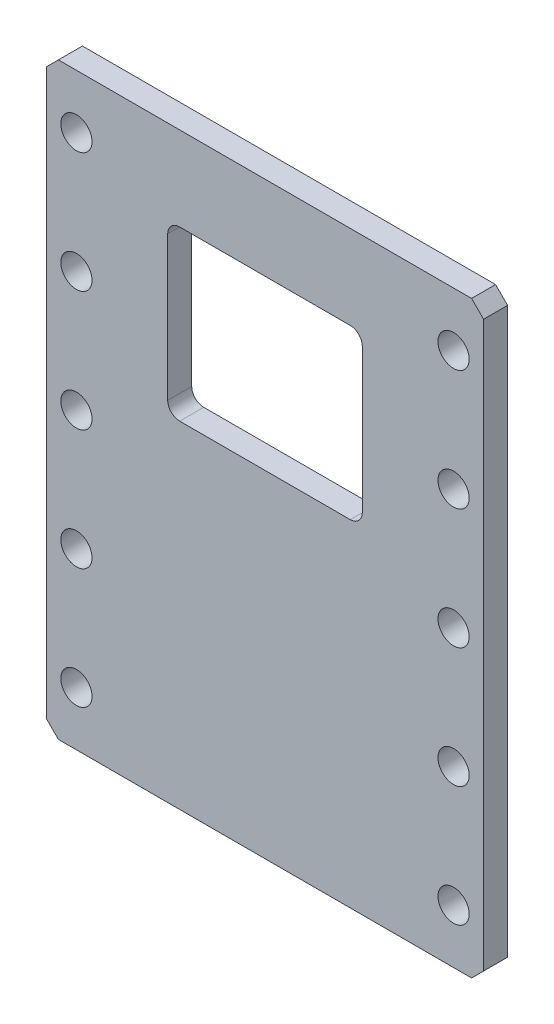
ISO-10303-21;
HEADER;
FILE_DESCRIPTION(('STEP AP214'),'2;1');
FILE_NAME('part.step','',(''),(''),'','','');
FILE_SCHEMA(('AUTOMOTIVE_DESIGN { 1 0 10303 214 1 1 1 1 }'));
ENDSEC;
DATA;
#1=APPLICATION_CONTEXT('core data for automotive mechanical design processes');
#2=APPLICATION_PROTOCOL_DEFINITION('international standard','automotive_design',2000,#1);
#3=PRODUCT_CONTEXT('',#1,'mechanical');
#4=PRODUCT('Part','Part','',(#3));
#5=PRODUCT_RELATED_PRODUCT_CATEGORY('part','',(#4));
#6=PRODUCT_DEFINITION_FORMATION('','',#4);
#7=PRODUCT_DEFINITION_CONTEXT('part definition',#1,'design');
#8=PRODUCT_DEFINITION('design','',#6,#7);
#9=PRODUCT_DEFINITION_SHAPE('','',#8);
#10=(LENGTH_UNIT() NAMED_UNIT(*) SI_UNIT(.MILLI.,.METRE.));
#11=(NAMED_UNIT(*) PLANE_ANGLE_UNIT() SI_UNIT($,.RADIAN.));
#12=(NAMED_UNIT(*) SI_UNIT($,.STERADIAN.) SOLID_ANGLE_UNIT());
#13=UNCERTAINTY_MEASURE_WITH_UNIT(LENGTH_MEASURE(1.E-05),#10,'distance_accuracy_value','');
#14=(GEOMETRIC_REPRESENTATION_CONTEXT(3) GLOBAL_UNCERTAINTY_ASSIGNED_CONTEXT((#13)) GLOBAL_UNIT_ASSIGNED_CONTEXT((#10,
#11,#12)) REPRESENTATION_CONTEXT('',''));
#15=CARTESIAN_POINT('',(0.,0.,0.));
#16=DIRECTION('',(0.,0.,1.));
#17=DIRECTION('',(1.,0.,0.));
#18=AXIS2_PLACEMENT_3D('',#15,#16,#17);
#19=CARTESIAN_POINT('',(182.,245.,20.));
#20=DIRECTION('',(-1.,0.,0.));
#21=DIRECTION('',(0.,-1.,0.));
#22=AXIS2_PLACEMENT_3D('',#19,#20,#21);
#23=PLANE('',#22);
#24=DIRECTION('',(0.,1.,0.));
#25=VECTOR('',#24,1.);
#26=CARTESIAN_POINT('',(182.,245.,20.));
#27=LINE('',#26,#25);
#28=CARTESIAN_POINT('',(182.,-235.,20.));
#29=VERTEX_POINT('',#28);
#30=CARTESIAN_POINT('',(182.,235.,20.));
#31=VERTEX_POINT('',#30);
#32=EDGE_CURVE('E272',#29,#31,#27,.T.);
#33=ORIENTED_EDGE('',*,*,#32,.F.);
#34=DIRECTION('',(0.,0.,-1.));
#35=VECTOR('',#34,1.);
#36=CARTESIAN_POINT('',(182.,-235.,20.));
#37=LINE('',#36,#35);
#38=CARTESIAN_POINT('',(182.,-235.,0.));
#39=VERTEX_POINT('',#38);
#40=EDGE_CURVE('E319',#29,#39,#37,.T.);
#41=ORIENTED_EDGE('',*,*,#40,.T.);
#42=DIRECTION('',(0.,1.,0.));
#43=VECTOR('',#42,1.);
#44=CARTESIAN_POINT('',(182.,245.,0.));
#45=LINE('',#44,#43);
#46=CARTESIAN_POINT('',(182.,235.,0.));
#47=VERTEX_POINT('',#46);
#48=EDGE_CURVE('E269',#39,#47,#45,.T.);
#49=ORIENTED_EDGE('',*,*,#48,.T.);
#50=DIRECTION('',(0.,0.,1.));
#51=VECTOR('',#50,1.);
#52=CARTESIAN_POINT('',(182.,235.,20.));
#53=LINE('',#52,#51);
#54=EDGE_CURVE('E317',#47,#31,#53,.T.);
#55=ORIENTED_EDGE('',*,*,#54,.T.);
#56=EDGE_LOOP('',(#33,#41,#49,#55));
#57=FACE_BOUND('',#56,.T.);
#58=ADVANCED_FACE('F35',(#57),#23,.F.);
#59=CARTESIAN_POINT('',(-182.,245.,20.));
#60=DIRECTION('',(0.,-1.,0.));
#61=DIRECTION('',(0.,0.,-1.));
#62=AXIS2_PLACEMENT_3D('',#59,#60,#61);
#63=PLANE('',#62);
#64=DIRECTION('',(-1.,0.,0.));
#65=VECTOR('',#64,1.);
#66=CARTESIAN_POINT('',(-182.,245.,0.));
#67=LINE('',#66,#65);
#68=CARTESIAN_POINT('',(172.,245.,0.));
#69=VERTEX_POINT('',#68);
#70=CARTESIAN_POINT('',(-172.,245.,0.));
#71=VERTEX_POINT('',#70);
#72=EDGE_CURVE('E286',#69,#71,#67,.T.);
#73=ORIENTED_EDGE('',*,*,#72,.T.);
#74=DIRECTION('',(0.,0.,1.));
#75=VECTOR('',#74,1.);
#76=CARTESIAN_POINT('',(-172.,245.,20.));
#77=LINE('',#76,#75);
#78=CARTESIAN_POINT('',(-172.,245.,20.));
#79=VERTEX_POINT('',#78);
#80=EDGE_CURVE('E11',#71,#79,#77,.T.);
#81=ORIENTED_EDGE('',*,*,#80,.T.);
#82=DIRECTION('',(-1.,0.,0.));
#83=VECTOR('',#82,1.);
#84=CARTESIAN_POINT('',(-182.,245.,20.));
#85=LINE('',#84,#83);
#86=CARTESIAN_POINT('',(172.,245.,20.));
#87=VERTEX_POINT('',#86);
#88=EDGE_CURVE('E274',#87,#79,#85,.T.);
#89=ORIENTED_EDGE('',*,*,#88,.F.);
#90=DIRECTION('',(0.,0.,-1.));
#91=VECTOR('',#90,1.);
#92=CARTESIAN_POINT('',(172.,245.,20.));
#93=LINE('',#92,#91);
#94=EDGE_CURVE('E43',#87,#69,#93,.T.);
#95=ORIENTED_EDGE('',*,*,#94,.T.);
#96=EDGE_LOOP('',(#73,#81,#89,#95));
#97=FACE_BOUND('',#96,.T.);
#98=ADVANCED_FACE('F324',(#97),#63,.F.);
#99=CARTESIAN_POINT('',(-182.,245.,20.));
#100=DIRECTION('',(1.,0.,0.));
#101=DIRECTION('',(0.,0.,-1.));
#102=AXIS2_PLACEMENT_3D('',#99,#100,#101);
#103=PLANE('',#102);
#104=DIRECTION('',(0.,-1.,0.));
#105=VECTOR('',#104,1.);
#106=CARTESIAN_POINT('',(-182.,245.,0.));
#107=LINE('',#106,#105);
#108=CARTESIAN_POINT('',(-182.,235.,0.));
#109=VERTEX_POINT('',#108);
#110=CARTESIAN_POINT('',(-182.,-235.,0.));
#111=VERTEX_POINT('',#110);
#112=EDGE_CURVE('E288',#109,#111,#107,.T.);
#113=ORIENTED_EDGE('',*,*,#112,.T.);
#114=DIRECTION('',(0.,0.,1.));
#115=VECTOR('',#114,1.);
#116=CARTESIAN_POINT('',(-182.,-235.,20.));
#117=LINE('',#116,#115);
#118=CARTESIAN_POINT('',(-182.,-235.,20.));
#119=VERTEX_POINT('',#118);
#120=EDGE_CURVE('E308',#111,#119,#117,.T.);
#121=ORIENTED_EDGE('',*,*,#120,.T.);
#122=DIRECTION('',(0.,-1.,0.));
#123=VECTOR('',#122,1.);
#124=CARTESIAN_POINT('',(-182.,245.,20.));
#125=LINE('',#124,#123);
#126=CARTESIAN_POINT('',(-182.,235.,20.));
#127=VERTEX_POINT('',#126);
#128=EDGE_CURVE('E277',#127,#119,#125,.T.);
#129=ORIENTED_EDGE('',*,*,#128,.F.);
#130=DIRECTION('',(0.,0.,-1.));
#131=VECTOR('',#130,1.);
#132=CARTESIAN_POINT('',(-182.,235.,20.));
#133=LINE('',#132,#131);
#134=EDGE_CURVE('E305',#127,#109,#133,.T.);
#135=ORIENTED_EDGE('',*,*,#134,.T.);
#136=EDGE_LOOP('',(#113,#121,#129,#135));
#137=FACE_BOUND('',#136,.T.);
#138=ADVANCED_FACE('F336',(#137),#103,.F.);
#139=CARTESIAN_POINT('',(-182.,-245.,20.));
#140=DIRECTION('',(0.,1.,0.));
#141=DIRECTION('',(0.,0.,1.));
#142=AXIS2_PLACEMENT_3D('',#139,#140,#141);
#143=PLANE('',#142);
#144=DIRECTION('',(1.,0.,0.));
#145=VECTOR('',#144,1.);
#146=CARTESIAN_POINT('',(-182.,-245.,20.));
#147=LINE('',#146,#145);
#148=CARTESIAN_POINT('',(-172.,-245.,20.));
#149=VERTEX_POINT('',#148);
#150=CARTESIAN_POINT('',(172.,-245.,20.));
#151=VERTEX_POINT('',#150);
#152=EDGE_CURVE('E280',#149,#151,#147,.T.);
#153=ORIENTED_EDGE('',*,*,#152,.F.);
#154=DIRECTION('',(0.,0.,-1.));
#155=VECTOR('',#154,1.);
#156=CARTESIAN_POINT('',(-172.,-245.,20.));
#157=LINE('',#156,#155);
#158=CARTESIAN_POINT('',(-172.,-245.,0.));
#159=VERTEX_POINT('',#158);
#160=EDGE_CURVE('E294',#149,#159,#157,.T.);
#161=ORIENTED_EDGE('',*,*,#160,.T.);
#162=DIRECTION('',(1.,0.,0.));
#163=VECTOR('',#162,1.);
#164=CARTESIAN_POINT('',(-182.,-245.,0.));
#165=LINE('',#164,#163);
#166=CARTESIAN_POINT('',(172.,-245.,0.));
#167=VERTEX_POINT('',#166);
#168=EDGE_CURVE('E275',#159,#167,#165,.T.);
#169=ORIENTED_EDGE('',*,*,#168,.T.);
#170=DIRECTION('',(0.,0.,1.));
#171=VECTOR('',#170,1.);
#172=CARTESIAN_POINT('',(172.,-245.,20.));
#173=LINE('',#172,#171);
#174=EDGE_CURVE('E283',#167,#151,#173,.T.);
#175=ORIENTED_EDGE('',*,*,#174,.T.);
#176=EDGE_LOOP('',(#153,#161,#169,#175));
#177=FACE_BOUND('',#176,.T.);
#178=ADVANCED_FACE('F345',(#177),#143,.F.);
#179=CARTESIAN_POINT('',(0.,0.,20.));
#180=DIRECTION('',(0.,0.,1.));
#181=DIRECTION('',(1.,0.,0.));
#182=AXIS2_PLACEMENT_3D('',#179,#180,#181);
#183=PLANE('',#182);
#184=CARTESIAN_POINT('',(157.,100.,20.));
#185=DIRECTION('',(0.,0.,1.));
#186=DIRECTION('',(-1.,0.,0.));
#187=AXIS2_PLACEMENT_3D('',#184,#185,#186);
#188=CIRCLE('',#187,13.);
#189=CARTESIAN_POINT('',(144.,100.,20.));
#190=VERTEX_POINT('',#189);
#191=EDGE_CURVE('E230',#190,#190,#188,.T.);
#192=ORIENTED_EDGE('',*,*,#191,.F.);
#193=EDGE_LOOP('',(#192));
#194=FACE_BOUND('',#193,.T.);
#195=CARTESIAN_POINT('',(157.,200.,20.));
#196=DIRECTION('',(0.,0.,1.));
#197=DIRECTION('',(-1.,0.,0.));
#198=AXIS2_PLACEMENT_3D('',#195,#196,#197);
#199=CIRCLE('',#198,13.);
#200=CARTESIAN_POINT('',(144.,200.,20.));
#201=VERTEX_POINT('',#200);
#202=EDGE_CURVE('E180',#201,#201,#199,.T.);
#203=ORIENTED_EDGE('',*,*,#202,.F.);
#204=EDGE_LOOP('',(#203));
#205=FACE_BOUND('',#204,.T.);
#206=CARTESIAN_POINT('',(-71.,45.,20.));
#207=DIRECTION('',(0.,0.,1.));
#208=DIRECTION('',(1.,0.,0.));
#209=AXIS2_PLACEMENT_3D('',#206,#207,#208);
#210=CIRCLE('',#209,10.);
#211=CARTESIAN_POINT('',(-81.,45.0000000000001,20.));
#212=VERTEX_POINT('',#211);
#213=CARTESIAN_POINT('',(-70.9999999999999,35.,20.));
#214=VERTEX_POINT('',#213);
#215=EDGE_CURVE('E155',#212,#214,#210,.T.);
#216=ORIENTED_EDGE('',*,*,#215,.F.);
#217=DIRECTION('',(0.,-1.,0.));
#218=VECTOR('',#217,1.);
#219=CARTESIAN_POINT('',(-81.,165.,20.));
#220=LINE('',#219,#218);
#221=CARTESIAN_POINT('',(-81.,165.,20.));
#222=VERTEX_POINT('',#221);
#223=EDGE_CURVE('E174',#222,#212,#220,.T.);
#224=ORIENTED_EDGE('',*,*,#223,.F.);
#225=CARTESIAN_POINT('',(-71.,165.,20.));
#226=DIRECTION('',(0.,0.,1.));
#227=DIRECTION('',(1.,0.,0.));
#228=AXIS2_PLACEMENT_3D('',#225,#226,#227);
#229=CIRCLE('',#228,10.);
#230=CARTESIAN_POINT('',(-71.,175.,20.));
#231=VERTEX_POINT('',#230);
#232=EDGE_CURVE('E177',#231,#222,#229,.T.);
#233=ORIENTED_EDGE('',*,*,#232,.F.);
#234=DIRECTION('',(-1.,0.,0.));
#235=VECTOR('',#234,1.);
#236=CARTESIAN_POINT('',(-71.,175.,20.));
#237=LINE('',#236,#235);
#238=CARTESIAN_POINT('',(70.9999999999999,175.,20.));
#239=VERTEX_POINT('',#238);
#240=EDGE_CURVE('E208',#239,#231,#237,.T.);
#241=ORIENTED_EDGE('',*,*,#240,.F.);
#242=CARTESIAN_POINT('',(71.,165.,20.));
#243=DIRECTION('',(0.,0.,1.));
#244=DIRECTION('',(-1.,0.,0.));
#245=AXIS2_PLACEMENT_3D('',#242,#243,#244);
#246=CIRCLE('',#245,10.);
#247=CARTESIAN_POINT('',(81.,165.,20.));
#248=VERTEX_POINT('',#247);
#249=EDGE_CURVE('E205',#248,#239,#246,.T.);
#250=ORIENTED_EDGE('',*,*,#249,.F.);
#251=DIRECTION('',(0.,1.,0.));
#252=VECTOR('',#251,1.);
#253=CARTESIAN_POINT('',(81.,165.,20.));
#254=LINE('',#253,#252);
#255=CARTESIAN_POINT('',(81.,45.0000000000001,20.));
#256=VERTEX_POINT('',#255);
#257=EDGE_CURVE('E202',#256,#248,#254,.T.);
#258=ORIENTED_EDGE('',*,*,#257,.F.);
#259=CARTESIAN_POINT('',(71.,45.,20.));
#260=DIRECTION('',(0.,0.,1.));
#261=DIRECTION('',(1.,0.,0.));
#262=AXIS2_PLACEMENT_3D('',#259,#260,#261);
#263=CIRCLE('',#262,10.);
#264=CARTESIAN_POINT('',(70.9999999999999,35.,20.));
#265=VERTEX_POINT('',#264);
#266=EDGE_CURVE('E199',#265,#256,#263,.T.);
#267=ORIENTED_EDGE('',*,*,#266,.F.);
#268=DIRECTION('',(1.,0.,0.));
#269=VECTOR('',#268,1.);
#270=CARTESIAN_POINT('',(-70.9999999999999,35.,20.));
#271=LINE('',#270,#269);
#272=EDGE_CURVE('E197',#214,#265,#271,.T.);
#273=ORIENTED_EDGE('',*,*,#272,.F.);
#274=EDGE_LOOP('',(#216,#224,#233,#241,#250,#258,#267,#273));
#275=FACE_BOUND('',#274,.T.);
#276=CARTESIAN_POINT('',(157.,0.,20.));
#277=DIRECTION('',(0.,0.,1.));
#278=DIRECTION('',(-1.,0.,0.));
#279=AXIS2_PLACEMENT_3D('',#276,#277,#278);
#280=CIRCLE('',#279,13.);
#281=CARTESIAN_POINT('',(144.,0.,20.));
#282=VERTEX_POINT('',#281);
#283=EDGE_CURVE('E229',#282,#282,#280,.T.);
#284=ORIENTED_EDGE('',*,*,#283,.F.);
#285=EDGE_LOOP('',(#284));
#286=FACE_BOUND('',#285,.T.);
#287=CARTESIAN_POINT('',(157.,-100.,20.));
#288=DIRECTION('',(0.,0.,1.));
#289=DIRECTION('',(-1.,0.,0.));
#290=AXIS2_PLACEMENT_3D('',#287,#288,#289);
#291=CIRCLE('',#290,13.);
#292=CARTESIAN_POINT('',(144.,-100.,20.));
#293=VERTEX_POINT('',#292);
#294=EDGE_CURVE('E623',#293,#293,#291,.T.);
#295=ORIENTED_EDGE('',*,*,#294,.F.);
#296=EDGE_LOOP('',(#295));
#297=FACE_BOUND('',#296,.T.);
#298=CARTESIAN_POINT('',(157.,-200.,20.));
#299=DIRECTION('',(0.,0.,1.));
#300=DIRECTION('',(-1.,0.,0.));
#301=AXIS2_PLACEMENT_3D('',#298,#299,#300);
#302=CIRCLE('',#301,13.);
#303=CARTESIAN_POINT('',(144.,-200.,20.));
#304=VERTEX_POINT('',#303);
#305=EDGE_CURVE('E262',#304,#304,#302,.T.);
#306=ORIENTED_EDGE('',*,*,#305,.F.);
#307=EDGE_LOOP('',(#306));
#308=FACE_BOUND('',#307,.T.);
#309=CARTESIAN_POINT('',(-157.,-200.,20.));
#310=DIRECTION('',(0.,0.,1.));
#311=DIRECTION('',(1.,0.,0.));
#312=AXIS2_PLACEMENT_3D('',#309,#310,#311);
#313=CIRCLE('',#312,13.);
#314=CARTESIAN_POINT('',(-144.,-200.,20.));
#315=VERTEX_POINT('',#314);
#316=EDGE_CURVE('E256',#315,#315,#313,.T.);
#317=ORIENTED_EDGE('',*,*,#316,.F.);
#318=EDGE_LOOP('',(#317));
#319=FACE_BOUND('',#318,.T.);
#320=CARTESIAN_POINT('',(-157.,-100.,20.));
#321=DIRECTION('',(0.,0.,1.));
#322=DIRECTION('',(1.,0.,0.));
#323=AXIS2_PLACEMENT_3D('',#320,#321,#322);
#324=CIRCLE('',#323,13.);
#325=CARTESIAN_POINT('',(-144.,-100.,20.));
#326=VERTEX_POINT('',#325);
#327=EDGE_CURVE('E250',#326,#326,#324,.T.);
#328=ORIENTED_EDGE('',*,*,#327,.F.);
#329=EDGE_LOOP('',(#328));
#330=FACE_BOUND('',#329,.T.);
#331=CARTESIAN_POINT('',(-157.,0.,20.));
#332=DIRECTION('',(0.,0.,1.));
#333=DIRECTION('',(1.,0.,0.));
#334=AXIS2_PLACEMENT_3D('',#331,#332,#333);
#335=CIRCLE('',#334,13.);
#336=CARTESIAN_POINT('',(-144.,0.,20.));
#337=VERTEX_POINT('',#336);
#338=EDGE_CURVE('E244',#337,#337,#335,.T.);
#339=ORIENTED_EDGE('',*,*,#338,.F.);
#340=EDGE_LOOP('',(#339));
#341=FACE_BOUND('',#340,.T.);
#342=CARTESIAN_POINT('',(-157.,100.,20.));
#343=DIRECTION('',(0.,0.,1.));
#344=DIRECTION('',(1.,0.,0.));
#345=AXIS2_PLACEMENT_3D('',#342,#343,#344);
#346=CIRCLE('',#345,13.);
#347=CARTESIAN_POINT('',(-144.,100.,20.));
#348=VERTEX_POINT('',#347);
#349=EDGE_CURVE('E238',#348,#348,#346,.T.);
#350=ORIENTED_EDGE('',*,*,#349,.F.);
#351=EDGE_LOOP('',(#350));
#352=FACE_BOUND('',#351,.T.);
#353=CARTESIAN_POINT('',(-157.,200.,20.));
#354=DIRECTION('',(0.,0.,1.));
#355=DIRECTION('',(1.,0.,0.));
#356=AXIS2_PLACEMENT_3D('',#353,#354,#355);
#357=CIRCLE('',#356,13.);
#358=CARTESIAN_POINT('',(-144.,200.,20.));
#359=VERTEX_POINT('',#358);
#360=EDGE_CURVE('E237',#359,#359,#357,.T.);
#361=ORIENTED_EDGE('',*,*,#360,.F.);
#362=EDGE_LOOP('',(#361));
#363=FACE_BOUND('',#362,.T.);
#364=ORIENTED_EDGE('',*,*,#128,.T.);
#365=DIRECTION('',(-0.707106781186548,0.707106781186548,0.));
#366=VECTOR('',#365,1.);
#367=CARTESIAN_POINT('',(-208.5,-208.5,20.));
#368=LINE('',#367,#366);
#369=EDGE_CURVE('E315',#119,#149,#368,.F.);
#370=ORIENTED_EDGE('',*,*,#369,.T.);
#371=ORIENTED_EDGE('',*,*,#152,.T.);
#372=DIRECTION('',(-0.707106781186548,-0.707106781186548,0.));
#373=VECTOR('',#372,1.);
#374=CARTESIAN_POINT('',(208.5,-208.5,20.));
#375=LINE('',#374,#373);
#376=EDGE_CURVE('E313',#151,#29,#375,.F.);
#377=ORIENTED_EDGE('',*,*,#376,.T.);
#378=ORIENTED_EDGE('',*,*,#32,.T.);
#379=DIRECTION('',(0.707106781186548,-0.707106781186548,0.));
#380=VECTOR('',#379,1.);
#381=CARTESIAN_POINT('',(208.5,208.5,20.));
#382=LINE('',#381,#380);
#383=EDGE_CURVE('E55',#31,#87,#382,.F.);
#384=ORIENTED_EDGE('',*,*,#383,.T.);
#385=ORIENTED_EDGE('',*,*,#88,.T.);
#386=DIRECTION('',(0.707106781186548,0.707106781186548,0.));
#387=VECTOR('',#386,1.);
#388=CARTESIAN_POINT('',(-208.5,208.5,20.));
#389=LINE('',#388,#387);
#390=EDGE_CURVE('E311',#79,#127,#389,.F.);
#391=ORIENTED_EDGE('',*,*,#390,.T.);
#392=EDGE_LOOP('',(#364,#370,#371,#377,#378,#384,#385,#391));
#393=FACE_BOUND('',#392,.T.);
#394=ADVANCED_FACE('F339',(#194,#205,#275,#286,#297,#308,#319,#330,#341,#352,#363,#393),#183,.T.);
#395=CARTESIAN_POINT('',(0.,0.,0.));
#396=DIRECTION('',(0.,0.,1.));
#397=DIRECTION('',(1.,0.,0.));
#398=AXIS2_PLACEMENT_3D('',#395,#396,#397);
#399=PLANE('',#398);
#400=CARTESIAN_POINT('',(157.,100.,0.));
#401=DIRECTION('',(0.,0.,1.));
#402=DIRECTION('',(-1.,0.,0.));
#403=AXIS2_PLACEMENT_3D('',#400,#401,#402);
#404=CIRCLE('',#403,13.);
#405=CARTESIAN_POINT('',(144.,100.,0.));
#406=VERTEX_POINT('',#405);
#407=EDGE_CURVE('E226',#406,#406,#404,.T.);
#408=ORIENTED_EDGE('',*,*,#407,.T.);
#409=EDGE_LOOP('',(#408));
#410=FACE_BOUND('',#409,.T.);
#411=CARTESIAN_POINT('',(157.,200.,0.));
#412=DIRECTION('',(0.,0.,1.));
#413=DIRECTION('',(-1.,0.,0.));
#414=AXIS2_PLACEMENT_3D('',#411,#412,#413);
#415=CIRCLE('',#414,13.);
#416=CARTESIAN_POINT('',(144.,200.,0.));
#417=VERTEX_POINT('',#416);
#418=EDGE_CURVE('E233',#417,#417,#415,.T.);
#419=ORIENTED_EDGE('',*,*,#418,.T.);
#420=EDGE_LOOP('',(#419));
#421=FACE_BOUND('',#420,.T.);
#422=DIRECTION('',(0.,-1.,0.));
#423=VECTOR('',#422,1.);
#424=CARTESIAN_POINT('',(-81.,165.,0.));
#425=LINE('',#424,#423);
#426=CARTESIAN_POINT('',(-81.,165.,0.));
#427=VERTEX_POINT('',#426);
#428=CARTESIAN_POINT('',(-81.,45.0000000000001,0.));
#429=VERTEX_POINT('',#428);
#430=EDGE_CURVE('E160',#427,#429,#425,.T.);
#431=ORIENTED_EDGE('',*,*,#430,.T.);
#432=CARTESIAN_POINT('',(-71.,45.,0.));
#433=DIRECTION('',(0.,0.,1.));
#434=DIRECTION('',(1.,0.,0.));
#435=AXIS2_PLACEMENT_3D('',#432,#433,#434);
#436=CIRCLE('',#435,10.);
#437=CARTESIAN_POINT('',(-70.9999999999999,35.,0.));
#438=VERTEX_POINT('',#437);
#439=EDGE_CURVE('E152',#429,#438,#436,.T.);
#440=ORIENTED_EDGE('',*,*,#439,.T.);
#441=DIRECTION('',(1.,0.,0.));
#442=VECTOR('',#441,1.);
#443=CARTESIAN_POINT('',(-70.9999999999999,35.,0.));
#444=LINE('',#443,#442);
#445=CARTESIAN_POINT('',(70.9999999999999,35.,0.));
#446=VERTEX_POINT('',#445);
#447=EDGE_CURVE('E164',#438,#446,#444,.T.);
#448=ORIENTED_EDGE('',*,*,#447,.T.);
#449=CARTESIAN_POINT('',(71.,45.,0.));
#450=DIRECTION('',(0.,0.,1.));
#451=DIRECTION('',(1.,0.,0.));
#452=AXIS2_PLACEMENT_3D('',#449,#450,#451);
#453=CIRCLE('',#452,10.);
#454=CARTESIAN_POINT('',(81.,45.0000000000001,0.));
#455=VERTEX_POINT('',#454);
#456=EDGE_CURVE('E168',#446,#455,#453,.T.);
#457=ORIENTED_EDGE('',*,*,#456,.T.);
#458=DIRECTION('',(0.,1.,0.));
#459=VECTOR('',#458,1.);
#460=CARTESIAN_POINT('',(81.,165.,0.));
#461=LINE('',#460,#459);
#462=CARTESIAN_POINT('',(81.,165.,0.));
#463=VERTEX_POINT('',#462);
#464=EDGE_CURVE('E184',#455,#463,#461,.T.);
#465=ORIENTED_EDGE('',*,*,#464,.T.);
#466=CARTESIAN_POINT('',(71.,165.,0.));
#467=DIRECTION('',(0.,0.,1.));
#468=DIRECTION('',(-1.,0.,0.));
#469=AXIS2_PLACEMENT_3D('',#466,#467,#468);
#470=CIRCLE('',#469,10.);
#471=CARTESIAN_POINT('',(70.9999999999999,175.,0.));
#472=VERTEX_POINT('',#471);
#473=EDGE_CURVE('E187',#463,#472,#470,.T.);
#474=ORIENTED_EDGE('',*,*,#473,.T.);
#475=DIRECTION('',(-1.,0.,0.));
#476=VECTOR('',#475,1.);
#477=CARTESIAN_POINT('',(-71.,175.,0.));
#478=LINE('',#477,#476);
#479=CARTESIAN_POINT('',(-71.,175.,0.));
#480=VERTEX_POINT('',#479);
#481=EDGE_CURVE('E190',#472,#480,#478,.T.);
#482=ORIENTED_EDGE('',*,*,#481,.T.);
#483=CARTESIAN_POINT('',(-71.,165.,0.));
#484=DIRECTION('',(0.,0.,1.));
#485=DIRECTION('',(1.,0.,0.));
#486=AXIS2_PLACEMENT_3D('',#483,#484,#485);
#487=CIRCLE('',#486,10.);
#488=EDGE_CURVE('E193',#480,#427,#487,.T.);
#489=ORIENTED_EDGE('',*,*,#488,.T.);
#490=EDGE_LOOP('',(#431,#440,#448,#457,#465,#474,#482,#489));
#491=FACE_BOUND('',#490,.T.);
#492=CARTESIAN_POINT('',(157.,0.,0.));
#493=DIRECTION('',(0.,0.,1.));
#494=DIRECTION('',(-1.,0.,0.));
#495=AXIS2_PLACEMENT_3D('',#492,#493,#494);
#496=CIRCLE('',#495,13.);
#497=CARTESIAN_POINT('',(144.,0.,0.));
#498=VERTEX_POINT('',#497);
#499=EDGE_CURVE('E642',#498,#498,#496,.T.);
#500=ORIENTED_EDGE('',*,*,#499,.T.);
#501=EDGE_LOOP('',(#500));
#502=FACE_BOUND('',#501,.T.);
#503=CARTESIAN_POINT('',(157.,-100.,0.));
#504=DIRECTION('',(0.,0.,1.));
#505=DIRECTION('',(-1.,0.,0.));
#506=AXIS2_PLACEMENT_3D('',#503,#504,#505);
#507=CIRCLE('',#506,13.);
#508=CARTESIAN_POINT('',(144.,-100.,0.));
#509=VERTEX_POINT('',#508);
#510=EDGE_CURVE('E265',#509,#509,#507,.T.);
#511=ORIENTED_EDGE('',*,*,#510,.T.);
#512=EDGE_LOOP('',(#511));
#513=FACE_BOUND('',#512,.T.);
#514=CARTESIAN_POINT('',(157.,-200.,0.));
#515=DIRECTION('',(0.,0.,1.));
#516=DIRECTION('',(-1.,0.,0.));
#517=AXIS2_PLACEMENT_3D('',#514,#515,#516);
#518=CIRCLE('',#517,13.);
#519=CARTESIAN_POINT('',(144.,-200.,0.));
#520=VERTEX_POINT('',#519);
#521=EDGE_CURVE('E259',#520,#520,#518,.T.);
#522=ORIENTED_EDGE('',*,*,#521,.T.);
#523=EDGE_LOOP('',(#522));
#524=FACE_BOUND('',#523,.T.);
#525=CARTESIAN_POINT('',(-157.,-200.,0.));
#526=DIRECTION('',(0.,0.,1.));
#527=DIRECTION('',(1.,0.,0.));
#528=AXIS2_PLACEMENT_3D('',#525,#526,#527);
#529=CIRCLE('',#528,13.);
#530=CARTESIAN_POINT('',(-144.,-200.,0.));
#531=VERTEX_POINT('',#530);
#532=EDGE_CURVE('E253',#531,#531,#529,.T.);
#533=ORIENTED_EDGE('',*,*,#532,.T.);
#534=EDGE_LOOP('',(#533));
#535=FACE_BOUND('',#534,.T.);
#536=CARTESIAN_POINT('',(-157.,-100.,0.));
#537=DIRECTION('',(0.,0.,1.));
#538=DIRECTION('',(1.,0.,0.));
#539=AXIS2_PLACEMENT_3D('',#536,#537,#538);
#540=CIRCLE('',#539,13.);
#541=CARTESIAN_POINT('',(-144.,-100.,0.));
#542=VERTEX_POINT('',#541);
#543=EDGE_CURVE('E247',#542,#542,#540,.T.);
#544=ORIENTED_EDGE('',*,*,#543,.T.);
#545=EDGE_LOOP('',(#544));
#546=FACE_BOUND('',#545,.T.);
#547=CARTESIAN_POINT('',(-157.,0.,0.));
#548=DIRECTION('',(0.,0.,1.));
#549=DIRECTION('',(1.,0.,0.));
#550=AXIS2_PLACEMENT_3D('',#547,#548,#549);
#551=CIRCLE('',#550,13.);
#552=CARTESIAN_POINT('',(-144.,0.,0.));
#553=VERTEX_POINT('',#552);
#554=EDGE_CURVE('E241',#553,#553,#551,.T.);
#555=ORIENTED_EDGE('',*,*,#554,.T.);
#556=EDGE_LOOP('',(#555));
#557=FACE_BOUND('',#556,.T.);
#558=CARTESIAN_POINT('',(-157.,100.,0.));
#559=DIRECTION('',(0.,0.,1.));
#560=DIRECTION('',(1.,0.,0.));
#561=AXIS2_PLACEMENT_3D('',#558,#559,#560);
#562=CIRCLE('',#561,13.);
#563=CARTESIAN_POINT('',(-144.,100.,0.));
#564=VERTEX_POINT('',#563);
#565=EDGE_CURVE('E234',#564,#564,#562,.T.);
#566=ORIENTED_EDGE('',*,*,#565,.T.);
#567=EDGE_LOOP('',(#566));
#568=FACE_BOUND('',#567,.T.);
#569=CARTESIAN_POINT('',(-157.,200.,0.));
#570=DIRECTION('',(0.,0.,1.));
#571=DIRECTION('',(1.,0.,0.));
#572=AXIS2_PLACEMENT_3D('',#569,#570,#571);
#573=CIRCLE('',#572,13.);
#574=CARTESIAN_POINT('',(-144.,200.,0.));
#575=VERTEX_POINT('',#574);
#576=EDGE_CURVE('E266',#575,#575,#573,.T.);
#577=ORIENTED_EDGE('',*,*,#576,.T.);
#578=EDGE_LOOP('',(#577));
#579=FACE_BOUND('',#578,.T.);
#580=ORIENTED_EDGE('',*,*,#168,.F.);
#581=DIRECTION('',(0.707106781186548,-0.707106781186548,0.));
#582=VECTOR('',#581,1.);
#583=CARTESIAN_POINT('',(-172.,-245.,0.));
#584=LINE('',#583,#582);
#585=EDGE_CURVE('E303',#159,#111,#584,.F.);
#586=ORIENTED_EDGE('',*,*,#585,.T.);
#587=ORIENTED_EDGE('',*,*,#112,.F.);
#588=DIRECTION('',(-0.707106781186548,-0.707106781186548,0.));
#589=VECTOR('',#588,1.);
#590=CARTESIAN_POINT('',(-182.,235.,0.));
#591=LINE('',#590,#589);
#592=EDGE_CURVE('E299',#109,#71,#591,.F.);
#593=ORIENTED_EDGE('',*,*,#592,.T.);
#594=ORIENTED_EDGE('',*,*,#72,.F.);
#595=DIRECTION('',(-0.707106781186548,0.707106781186548,0.));
#596=VECTOR('',#595,1.);
#597=CARTESIAN_POINT('',(172.,245.,0.));
#598=LINE('',#597,#596);
#599=EDGE_CURVE('E297',#69,#47,#598,.F.);
#600=ORIENTED_EDGE('',*,*,#599,.T.);
#601=ORIENTED_EDGE('',*,*,#48,.F.);
#602=DIRECTION('',(0.707106781186548,0.707106781186548,0.));
#603=VECTOR('',#602,1.);
#604=CARTESIAN_POINT('',(182.,-235.,0.));
#605=LINE('',#604,#603);
#606=EDGE_CURVE('E301',#39,#167,#605,.F.);
#607=ORIENTED_EDGE('',*,*,#606,.T.);
#608=EDGE_LOOP('',(#580,#586,#587,#593,#594,#600,#601,#607));
#609=FACE_BOUND('',#608,.T.);
#610=ADVANCED_FACE('F170',(#410,#421,#491,#502,#513,#524,#535,#546,#557,#568,#579,#609),#399,.F.);
#611=CARTESIAN_POINT('',(-157.,200.,0.));
#612=DIRECTION('',(0.,0.,1.));
#613=DIRECTION('',(1.,0.,0.));
#614=AXIS2_PLACEMENT_3D('',#611,#612,#613);
#615=CYLINDRICAL_SURFACE('',#614,13.);
#616=ORIENTED_EDGE('',*,*,#576,.F.);
#617=EDGE_LOOP('',(#616));
#618=FACE_BOUND('',#617,.T.);
#619=ORIENTED_EDGE('',*,*,#360,.T.);
#620=EDGE_LOOP('',(#619));
#621=FACE_BOUND('',#620,.T.);
#622=ADVANCED_FACE('F539',(#618,#621),#615,.F.);
#623=CARTESIAN_POINT('',(-157.,100.,0.));
#624=DIRECTION('',(0.,0.,1.));
#625=DIRECTION('',(1.,0.,0.));
#626=AXIS2_PLACEMENT_3D('',#623,#624,#625);
#627=CYLINDRICAL_SURFACE('',#626,13.);
#628=ORIENTED_EDGE('',*,*,#565,.F.);
#629=EDGE_LOOP('',(#628));
#630=FACE_BOUND('',#629,.T.);
#631=ORIENTED_EDGE('',*,*,#349,.T.);
#632=EDGE_LOOP('',(#631));
#633=FACE_BOUND('',#632,.T.);
#634=ADVANCED_FACE('F530',(#630,#633),#627,.F.);
#635=CARTESIAN_POINT('',(-157.,0.,0.));
#636=DIRECTION('',(0.,0.,1.));
#637=DIRECTION('',(1.,0.,0.));
#638=AXIS2_PLACEMENT_3D('',#635,#636,#637);
#639=CYLINDRICAL_SURFACE('',#638,13.);
#640=ORIENTED_EDGE('',*,*,#554,.F.);
#641=EDGE_LOOP('',(#640));
#642=FACE_BOUND('',#641,.T.);
#643=ORIENTED_EDGE('',*,*,#338,.T.);
#644=EDGE_LOOP('',(#643));
#645=FACE_BOUND('',#644,.T.);
#646=ADVANCED_FACE('F521',(#642,#645),#639,.F.);
#647=CARTESIAN_POINT('',(-157.,-100.,0.));
#648=DIRECTION('',(0.,0.,1.));
#649=DIRECTION('',(1.,0.,0.));
#650=AXIS2_PLACEMENT_3D('',#647,#648,#649);
#651=CYLINDRICAL_SURFACE('',#650,13.);
#652=ORIENTED_EDGE('',*,*,#543,.F.);
#653=EDGE_LOOP('',(#652));
#654=FACE_BOUND('',#653,.T.);
#655=ORIENTED_EDGE('',*,*,#327,.T.);
#656=EDGE_LOOP('',(#655));
#657=FACE_BOUND('',#656,.T.);
#658=ADVANCED_FACE('F512',(#654,#657),#651,.F.);
#659=CARTESIAN_POINT('',(-157.,-200.,0.));
#660=DIRECTION('',(0.,0.,1.));
#661=DIRECTION('',(1.,0.,0.));
#662=AXIS2_PLACEMENT_3D('',#659,#660,#661);
#663=CYLINDRICAL_SURFACE('',#662,13.);
#664=ORIENTED_EDGE('',*,*,#532,.F.);
#665=EDGE_LOOP('',(#664));
#666=FACE_BOUND('',#665,.T.);
#667=ORIENTED_EDGE('',*,*,#316,.T.);
#668=EDGE_LOOP('',(#667));
#669=FACE_BOUND('',#668,.T.);
#670=ADVANCED_FACE('F503',(#666,#669),#663,.F.);
#671=CARTESIAN_POINT('',(157.,-200.,0.));
#672=DIRECTION('',(0.,0.,1.));
#673=DIRECTION('',(1.,0.,0.));
#674=AXIS2_PLACEMENT_3D('',#671,#672,#673);
#675=CYLINDRICAL_SURFACE('',#674,13.);
#676=ORIENTED_EDGE('',*,*,#521,.F.);
#677=EDGE_LOOP('',(#676));
#678=FACE_BOUND('',#677,.T.);
#679=ORIENTED_EDGE('',*,*,#305,.T.);
#680=EDGE_LOOP('',(#679));
#681=FACE_BOUND('',#680,.T.);
#682=ADVANCED_FACE('F494',(#678,#681),#675,.F.);
#683=CARTESIAN_POINT('',(157.,-100.,0.));
#684=DIRECTION('',(0.,0.,1.));
#685=DIRECTION('',(1.,0.,0.));
#686=AXIS2_PLACEMENT_3D('',#683,#684,#685);
#687=CYLINDRICAL_SURFACE('',#686,13.);
#688=ORIENTED_EDGE('',*,*,#510,.F.);
#689=EDGE_LOOP('',(#688));
#690=FACE_BOUND('',#689,.T.);
#691=ORIENTED_EDGE('',*,*,#294,.T.);
#692=EDGE_LOOP('',(#691));
#693=FACE_BOUND('',#692,.T.);
#694=ADVANCED_FACE('F485',(#690,#693),#687,.F.);
#695=CARTESIAN_POINT('',(157.,0.,0.));
#696=DIRECTION('',(0.,0.,1.));
#697=DIRECTION('',(1.,0.,0.));
#698=AXIS2_PLACEMENT_3D('',#695,#696,#697);
#699=CYLINDRICAL_SURFACE('',#698,13.);
#700=ORIENTED_EDGE('',*,*,#499,.F.);
#701=EDGE_LOOP('',(#700));
#702=FACE_BOUND('',#701,.T.);
#703=ORIENTED_EDGE('',*,*,#283,.T.);
#704=EDGE_LOOP('',(#703));
#705=FACE_BOUND('',#704,.T.);
#706=ADVANCED_FACE('F477',(#702,#705),#699,.F.);
#707=CARTESIAN_POINT('',(-71.,45.,0.));
#708=DIRECTION('',(0.,0.,1.));
#709=DIRECTION('',(1.,0.,0.));
#710=AXIS2_PLACEMENT_3D('',#707,#708,#709);
#711=CYLINDRICAL_SURFACE('',#710,10.);
#712=ORIENTED_EDGE('',*,*,#215,.T.);
#713=DIRECTION('',(0.,0.,1.));
#714=VECTOR('',#713,1.);
#715=CARTESIAN_POINT('',(-70.9999999999999,35.,0.));
#716=LINE('',#715,#714);
#717=EDGE_CURVE('E148',#438,#214,#716,.T.);
#718=ORIENTED_EDGE('',*,*,#717,.F.);
#719=ORIENTED_EDGE('',*,*,#439,.F.);
#720=DIRECTION('',(0.,0.,1.));
#721=VECTOR('',#720,1.);
#722=CARTESIAN_POINT('',(-81.,45.0000000000001,0.));
#723=LINE('',#722,#721);
#724=EDGE_CURVE('E213',#429,#212,#723,.T.);
#725=ORIENTED_EDGE('',*,*,#724,.T.);
#726=EDGE_LOOP('',(#712,#718,#719,#725));
#727=FACE_BOUND('',#726,.T.);
#728=ADVANCED_FACE('F150',(#727),#711,.F.);
#729=CARTESIAN_POINT('',(-81.,165.,0.));
#730=DIRECTION('',(-1.,0.,0.));
#731=DIRECTION('',(0.,-1.,0.));
#732=AXIS2_PLACEMENT_3D('',#729,#730,#731);
#733=PLANE('',#732);
#734=ORIENTED_EDGE('',*,*,#223,.T.);
#735=ORIENTED_EDGE('',*,*,#724,.F.);
#736=ORIENTED_EDGE('',*,*,#430,.F.);
#737=DIRECTION('',(0.,0.,1.));
#738=VECTOR('',#737,1.);
#739=CARTESIAN_POINT('',(-81.,165.,0.));
#740=LINE('',#739,#738);
#741=EDGE_CURVE('E215',#427,#222,#740,.T.);
#742=ORIENTED_EDGE('',*,*,#741,.T.);
#743=EDGE_LOOP('',(#734,#735,#736,#742));
#744=FACE_BOUND('',#743,.T.);
#745=ADVANCED_FACE('F460',(#744),#733,.F.);
#746=CARTESIAN_POINT('',(-71.,165.,0.));
#747=DIRECTION('',(0.,0.,1.));
#748=DIRECTION('',(1.,0.,0.));
#749=AXIS2_PLACEMENT_3D('',#746,#747,#748);
#750=CYLINDRICAL_SURFACE('',#749,10.);
#751=ORIENTED_EDGE('',*,*,#232,.T.);
#752=ORIENTED_EDGE('',*,*,#741,.F.);
#753=ORIENTED_EDGE('',*,*,#488,.F.);
#754=DIRECTION('',(0.,0.,1.));
#755=VECTOR('',#754,1.);
#756=CARTESIAN_POINT('',(-71.,175.,0.));
#757=LINE('',#756,#755);
#758=EDGE_CURVE('E217',#480,#231,#757,.T.);
#759=ORIENTED_EDGE('',*,*,#758,.T.);
#760=EDGE_LOOP('',(#751,#752,#753,#759));
#761=FACE_BOUND('',#760,.T.);
#762=ADVANCED_FACE('F451',(#761),#750,.F.);
#763=CARTESIAN_POINT('',(-71.,175.,0.));
#764=DIRECTION('',(0.,1.,0.));
#765=DIRECTION('',(0.,0.,1.));
#766=AXIS2_PLACEMENT_3D('',#763,#764,#765);
#767=PLANE('',#766);
#768=ORIENTED_EDGE('',*,*,#240,.T.);
#769=ORIENTED_EDGE('',*,*,#758,.F.);
#770=ORIENTED_EDGE('',*,*,#481,.F.);
#771=DIRECTION('',(0.,0.,1.));
#772=VECTOR('',#771,1.);
#773=CARTESIAN_POINT('',(70.9999999999999,175.,0.));
#774=LINE('',#773,#772);
#775=EDGE_CURVE('E219',#472,#239,#774,.T.);
#776=ORIENTED_EDGE('',*,*,#775,.T.);
#777=EDGE_LOOP('',(#768,#769,#770,#776));
#778=FACE_BOUND('',#777,.T.);
#779=ADVANCED_FACE('F442',(#778),#767,.F.);
#780=CARTESIAN_POINT('',(71.,165.,0.));
#781=DIRECTION('',(0.,0.,1.));
#782=DIRECTION('',(1.,0.,0.));
#783=AXIS2_PLACEMENT_3D('',#780,#781,#782);
#784=CYLINDRICAL_SURFACE('',#783,10.);
#785=ORIENTED_EDGE('',*,*,#249,.T.);
#786=ORIENTED_EDGE('',*,*,#775,.F.);
#787=ORIENTED_EDGE('',*,*,#473,.F.);
#788=DIRECTION('',(0.,0.,1.));
#789=VECTOR('',#788,1.);
#790=CARTESIAN_POINT('',(81.,165.,0.));
#791=LINE('',#790,#789);
#792=EDGE_CURVE('E221',#463,#248,#791,.T.);
#793=ORIENTED_EDGE('',*,*,#792,.T.);
#794=EDGE_LOOP('',(#785,#786,#787,#793));
#795=FACE_BOUND('',#794,.T.);
#796=ADVANCED_FACE('F433',(#795),#784,.F.);
#797=CARTESIAN_POINT('',(81.,165.,0.));
#798=DIRECTION('',(1.,0.,0.));
#799=DIRECTION('',(0.,1.,0.));
#800=AXIS2_PLACEMENT_3D('',#797,#798,#799);
#801=PLANE('',#800);
#802=ORIENTED_EDGE('',*,*,#257,.T.);
#803=ORIENTED_EDGE('',*,*,#792,.F.);
#804=ORIENTED_EDGE('',*,*,#464,.F.);
#805=DIRECTION('',(0.,0.,1.));
#806=VECTOR('',#805,1.);
#807=CARTESIAN_POINT('',(81.,45.0000000000001,0.));
#808=LINE('',#807,#806);
#809=EDGE_CURVE('E223',#455,#256,#808,.T.);
#810=ORIENTED_EDGE('',*,*,#809,.T.);
#811=EDGE_LOOP('',(#802,#803,#804,#810));
#812=FACE_BOUND('',#811,.T.);
#813=ADVANCED_FACE('F424',(#812),#801,.F.);
#814=CARTESIAN_POINT('',(71.,45.,0.));
#815=DIRECTION('',(0.,0.,1.));
#816=DIRECTION('',(1.,0.,0.));
#817=AXIS2_PLACEMENT_3D('',#814,#815,#816);
#818=CYLINDRICAL_SURFACE('',#817,10.);
#819=ORIENTED_EDGE('',*,*,#266,.T.);
#820=ORIENTED_EDGE('',*,*,#809,.F.);
#821=ORIENTED_EDGE('',*,*,#456,.F.);
#822=DIRECTION('',(0.,0.,1.));
#823=VECTOR('',#822,1.);
#824=CARTESIAN_POINT('',(70.9999999999999,35.,0.));
#825=LINE('',#824,#823);
#826=EDGE_CURVE('E159',#446,#265,#825,.T.);
#827=ORIENTED_EDGE('',*,*,#826,.T.);
#828=EDGE_LOOP('',(#819,#820,#821,#827));
#829=FACE_BOUND('',#828,.T.);
#830=ADVANCED_FACE('F416',(#829),#818,.F.);
#831=CARTESIAN_POINT('',(-70.9999999999999,35.,0.));
#832=DIRECTION('',(0.,-1.,0.));
#833=DIRECTION('',(1.,0.,0.));
#834=AXIS2_PLACEMENT_3D('',#831,#832,#833);
#835=PLANE('',#834);
#836=ORIENTED_EDGE('',*,*,#272,.T.);
#837=ORIENTED_EDGE('',*,*,#826,.F.);
#838=ORIENTED_EDGE('',*,*,#447,.F.);
#839=ORIENTED_EDGE('',*,*,#717,.T.);
#840=EDGE_LOOP('',(#836,#837,#838,#839));
#841=FACE_BOUND('',#840,.T.);
#842=ADVANCED_FACE('F165',(#841),#835,.F.);
#843=CARTESIAN_POINT('',(157.,200.,0.));
#844=DIRECTION('',(0.,0.,1.));
#845=DIRECTION('',(1.,0.,0.));
#846=AXIS2_PLACEMENT_3D('',#843,#844,#845);
#847=CYLINDRICAL_SURFACE('',#846,13.);
#848=ORIENTED_EDGE('',*,*,#418,.F.);
#849=EDGE_LOOP('',(#848));
#850=FACE_BOUND('',#849,.T.);
#851=ORIENTED_EDGE('',*,*,#202,.T.);
#852=EDGE_LOOP('',(#851));
#853=FACE_BOUND('',#852,.T.);
#854=ADVANCED_FACE('F399',(#850,#853),#847,.F.);
#855=CARTESIAN_POINT('',(157.,100.,0.));
#856=DIRECTION('',(0.,0.,1.));
#857=DIRECTION('',(1.,0.,0.));
#858=AXIS2_PLACEMENT_3D('',#855,#856,#857);
#859=CYLINDRICAL_SURFACE('',#858,13.);
#860=ORIENTED_EDGE('',*,*,#407,.F.);
#861=EDGE_LOOP('',(#860));
#862=FACE_BOUND('',#861,.T.);
#863=ORIENTED_EDGE('',*,*,#191,.T.);
#864=EDGE_LOOP('',(#863));
#865=FACE_BOUND('',#864,.T.);
#866=ADVANCED_FACE('F368',(#862,#865),#859,.F.);
#867=CARTESIAN_POINT('',(-172.,-245.,20.));
#868=DIRECTION('',(0.707106781186547,0.707106781186547,0.));
#869=DIRECTION('',(0.,0.,-1.));
#870=AXIS2_PLACEMENT_3D('',#867,#868,#869);
#871=PLANE('',#870);
#872=ORIENTED_EDGE('',*,*,#369,.F.);
#873=ORIENTED_EDGE('',*,*,#120,.F.);
#874=ORIENTED_EDGE('',*,*,#585,.F.);
#875=ORIENTED_EDGE('',*,*,#160,.F.);
#876=EDGE_LOOP('',(#872,#873,#874,#875));
#877=FACE_BOUND('',#876,.T.);
#878=ADVANCED_FACE('F343',(#877),#871,.F.);
#879=CARTESIAN_POINT('',(182.,-235.,20.));
#880=DIRECTION('',(-0.707106781186547,0.707106781186547,0.));
#881=DIRECTION('',(0.,0.,-1.));
#882=AXIS2_PLACEMENT_3D('',#879,#880,#881);
#883=PLANE('',#882);
#884=ORIENTED_EDGE('',*,*,#376,.F.);
#885=ORIENTED_EDGE('',*,*,#174,.F.);
#886=ORIENTED_EDGE('',*,*,#606,.F.);
#887=ORIENTED_EDGE('',*,*,#40,.F.);
#888=EDGE_LOOP('',(#884,#885,#886,#887));
#889=FACE_BOUND('',#888,.T.);
#890=ADVANCED_FACE('F350',(#889),#883,.F.);
#891=CARTESIAN_POINT('',(-182.,235.,20.));
#892=DIRECTION('',(0.707106781186547,-0.707106781186547,0.));
#893=DIRECTION('',(0.,0.,-1.));
#894=AXIS2_PLACEMENT_3D('',#891,#892,#893);
#895=PLANE('',#894);
#896=ORIENTED_EDGE('',*,*,#390,.F.);
#897=ORIENTED_EDGE('',*,*,#80,.F.);
#898=ORIENTED_EDGE('',*,*,#592,.F.);
#899=ORIENTED_EDGE('',*,*,#134,.F.);
#900=EDGE_LOOP('',(#896,#897,#898,#899));
#901=FACE_BOUND('',#900,.T.);
#902=ADVANCED_FACE('F333',(#901),#895,.F.);
#903=CARTESIAN_POINT('',(172.,245.,20.));
#904=DIRECTION('',(-0.707106781186547,-0.707106781186547,0.));
#905=DIRECTION('',(0.,0.,-1.));
#906=AXIS2_PLACEMENT_3D('',#903,#904,#905);
#907=PLANE('',#906);
#908=ORIENTED_EDGE('',*,*,#383,.F.);
#909=ORIENTED_EDGE('',*,*,#54,.F.);
#910=ORIENTED_EDGE('',*,*,#599,.F.);
#911=ORIENTED_EDGE('',*,*,#94,.F.);
#912=EDGE_LOOP('',(#908,#909,#910,#911));
#913=FACE_BOUND('',#912,.T.);
#914=ADVANCED_FACE('F37',(#913),#907,.F.);
#915=CLOSED_SHELL('',(#58,#98,#138,#178,#394,#610,#622,#634,#646,#658,#670,#682,#694,#706,#728,
#745,#762,#779,#796,#813,#830,#842,#854,#866,#878,#890,#902,#914));
#916=MANIFOLD_SOLID_BREP('B2',#915);
#917=ADVANCED_BREP_SHAPE_REPRESENTATION('',(#18,#916),#14);
#918=SHAPE_DEFINITION_REPRESENTATION(#9,#917);
ENDSEC;
END-ISO-10303-21;
